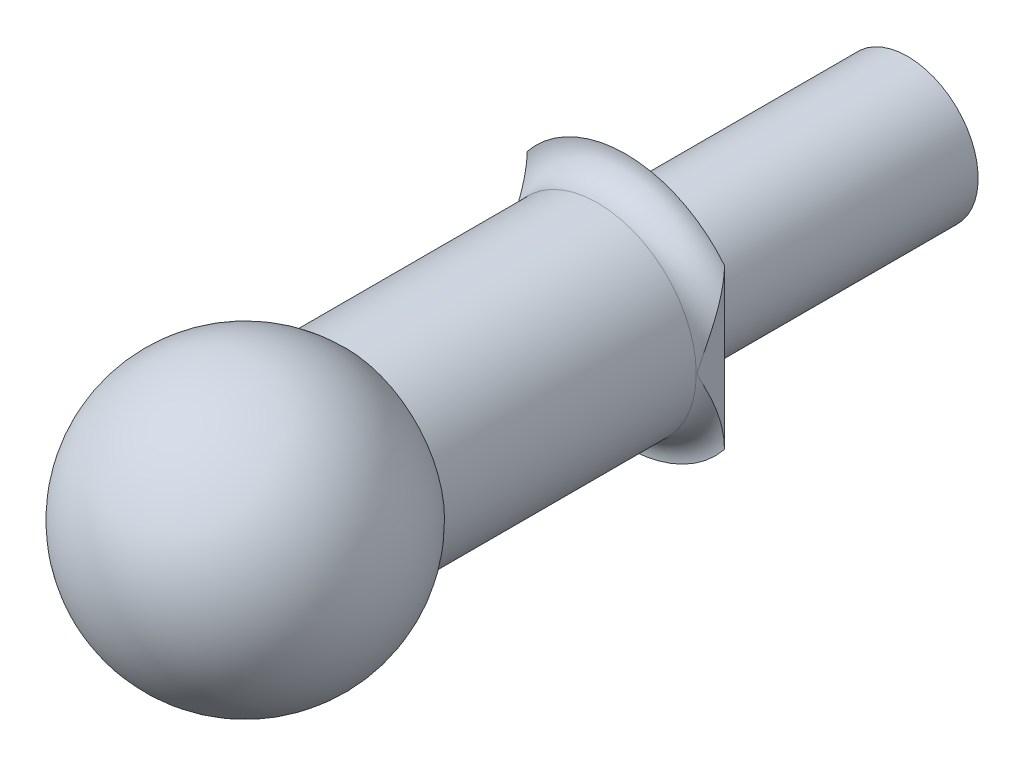
ISO-10303-21;
HEADER;
FILE_DESCRIPTION(('STEP AP214'),'2;1');
FILE_NAME('part.step','',(''),(''),'','','');
FILE_SCHEMA(('AUTOMOTIVE_DESIGN { 1 0 10303 214 1 1 1 1 }'));
ENDSEC;
DATA;
#1=APPLICATION_CONTEXT('core data for automotive mechanical design processes');
#2=APPLICATION_PROTOCOL_DEFINITION('international standard','automotive_design',2000,#1);
#3=PRODUCT_CONTEXT('',#1,'mechanical');
#4=PRODUCT('Part','Part','',(#3));
#5=PRODUCT_RELATED_PRODUCT_CATEGORY('part','',(#4));
#6=PRODUCT_DEFINITION_FORMATION('','',#4);
#7=PRODUCT_DEFINITION_CONTEXT('part definition',#1,'design');
#8=PRODUCT_DEFINITION('design','',#6,#7);
#9=PRODUCT_DEFINITION_SHAPE('','',#8);
#10=(LENGTH_UNIT() NAMED_UNIT(*) SI_UNIT(.MILLI.,.METRE.));
#11=(NAMED_UNIT(*) PLANE_ANGLE_UNIT() SI_UNIT($,.RADIAN.));
#12=(NAMED_UNIT(*) SI_UNIT($,.STERADIAN.) SOLID_ANGLE_UNIT());
#13=UNCERTAINTY_MEASURE_WITH_UNIT(LENGTH_MEASURE(1.E-05),#10,'distance_accuracy_value','');
#14=(GEOMETRIC_REPRESENTATION_CONTEXT(3) GLOBAL_UNCERTAINTY_ASSIGNED_CONTEXT((#13)) GLOBAL_UNIT_ASSIGNED_CONTEXT((#10,
#11,#12)) REPRESENTATION_CONTEXT('',''));
#15=CARTESIAN_POINT('',(0.,0.,0.));
#16=DIRECTION('',(0.,0.,1.));
#17=DIRECTION('',(1.,0.,0.));
#18=AXIS2_PLACEMENT_3D('',#15,#16,#17);
#19=CARTESIAN_POINT('',(91.6988035290815,-24.5,20.));
#20=DIRECTION('',(0.,0.,1.));
#21=DIRECTION('',(1.,0.,0.));
#22=AXIS2_PLACEMENT_3D('',#19,#20,#21);
#23=PLANE('',#22);
#24=CARTESIAN_POINT('',(80.,0.,20.));
#25=DIRECTION('',(0.,0.,-1.));
#26=DIRECTION('',(-1.,0.,0.));
#27=AXIS2_PLACEMENT_3D('',#24,#25,#26);
#28=CIRCLE('',#27,2.50000000000001);
#29=CARTESIAN_POINT('',(78.1001644808037,1.625,20.));
#30=VERTEX_POINT('',#29);
#31=CARTESIAN_POINT('',(78.1001644808037,-1.625,20.));
#32=VERTEX_POINT('',#31);
#33=EDGE_CURVE('E212',#30,#32,#28,.T.);
#34=ORIENTED_EDGE('',*,*,#33,.F.);
#35=DIRECTION('',(0.,1.,0.));
#36=VECTOR('',#35,1.);
#37=CARTESIAN_POINT('',(78.1001644808037,1.625,20.));
#38=LINE('',#37,#36);
#39=EDGE_CURVE('E214',#32,#30,#38,.T.);
#40=ORIENTED_EDGE('',*,*,#39,.F.);
#41=EDGE_LOOP('',(#34,#40));
#42=FACE_BOUND('',#41,.T.);
#43=DIRECTION('',(0.,-1.,0.));
#44=VECTOR('',#43,1.);
#45=CARTESIAN_POINT('',(83.5007284956135,0.,20.));
#46=LINE('',#45,#44);
#47=CARTESIAN_POINT('',(83.5007284956135,2.82752541986805,20.));
#48=VERTEX_POINT('',#47);
#49=CARTESIAN_POINT('',(83.5007284956135,-2.82752541986805,20.));
#50=VERTEX_POINT('',#49);
#51=EDGE_CURVE('E76',#48,#50,#46,.T.);
#52=ORIENTED_EDGE('',*,*,#51,.T.);
#53=CARTESIAN_POINT('',(80.,0.,20.));
#54=DIRECTION('',(0.,0.,-1.));
#55=DIRECTION('',(0.,1.,0.));
#56=AXIS2_PLACEMENT_3D('',#53,#54,#55);
#57=CIRCLE('',#56,4.5);
#58=CARTESIAN_POINT('',(76.4992715043866,-2.82752541986805,20.));
#59=VERTEX_POINT('',#58);
#60=EDGE_CURVE('E102',#50,#59,#57,.T.);
#61=ORIENTED_EDGE('',*,*,#60,.T.);
#62=DIRECTION('',(0.,-1.,0.));
#63=VECTOR('',#62,1.);
#64=CARTESIAN_POINT('',(76.4992715043866,0.,20.));
#65=LINE('',#64,#63);
#66=CARTESIAN_POINT('',(76.4992715043866,2.82752541986805,20.));
#67=VERTEX_POINT('',#66);
#68=EDGE_CURVE('E69',#67,#59,#65,.T.);
#69=ORIENTED_EDGE('',*,*,#68,.F.);
#70=EDGE_CURVE('E101',#67,#48,#57,.T.);
#71=ORIENTED_EDGE('',*,*,#70,.T.);
#72=EDGE_LOOP('',(#52,#61,#69,#71));
#73=FACE_BOUND('',#72,.T.);
#74=ADVANCED_FACE('F49',(#42,#73),#23,.F.);
#75=CARTESIAN_POINT('',(80.,0.,21.));
#76=DIRECTION('',(0.,0.,-1.));
#77=DIRECTION('',(0.,1.,0.));
#78=AXIS2_PLACEMENT_3D('',#75,#76,#77);
#79=TOROIDAL_SURFACE('',#78,4.5,1.);
#80=CARTESIAN_POINT('',(80.,0.,21.));
#81=DIRECTION('',(0.,0.,-1.));
#82=DIRECTION('',(0.,1.,0.));
#83=AXIS2_PLACEMENT_3D('',#80,#81,#82);
#84=CIRCLE('',#83,3.5);
#85=CARTESIAN_POINT('',(80.,3.49999999999999,21.));
#86=VERTEX_POINT('',#85);
#87=EDGE_CURVE('E110',#86,#86,#84,.T.);
#88=ORIENTED_EDGE('',*,*,#87,.T.);
#89=EDGE_LOOP('',(#88));
#90=FACE_BOUND('',#89,.T.);
#91=ORIENTED_EDGE('',*,*,#60,.F.);
#92=CARTESIAN_POINT('',(83.5007284956135,0.,20.9618363979552));
#93=CARTESIAN_POINT('',(83.5007284956135,0.00757466413143832,20.9618337924515));
#94=CARTESIAN_POINT('',(83.5007284956135,0.0151524918470172,20.9611702669489));
#95=CARTESIAN_POINT('',(83.5007284956135,0.0301410912420999,20.9587584599739));
#96=CARTESIAN_POINT('',(83.5007284956135,0.0375511585872441,20.9570062589756));
#97=CARTESIAN_POINT('',(83.5007284956135,0.0598823413708445,20.9506798754329));
#98=CARTESIAN_POINT('',(83.5007284956135,0.0744888281179546,20.9450777984116));
#99=CARTESIAN_POINT('',(83.5007284956135,0.116560752386152,20.9275792933788));
#100=CARTESIAN_POINT('',(83.5007284956135,0.14353246081445,20.9146225142181));
#101=CARTESIAN_POINT('',(83.5007284956135,0.197247647198134,20.8881801458461));
#102=CARTESIAN_POINT('',(83.5007284956135,0.223990835945403,20.8746939810419));
#103=CARTESIAN_POINT('',(83.5007284956135,0.276964187418344,20.8477296635443));
#104=CARTESIAN_POINT('',(83.5007284956135,0.30319591323833,20.834254579402));
#105=CARTESIAN_POINT('',(83.5007284956135,0.355631985890928,20.8072826989106));
#106=CARTESIAN_POINT('',(83.5007284956135,0.381836339818784,20.7937859160433));
#107=CARTESIAN_POINT('',(83.5007284956135,0.513412730519663,20.7261574822235));
#108=CARTESIAN_POINT('',(83.5007284956135,0.61896176584393,20.6723607670523));
#109=CARTESIAN_POINT('',(83.5007284956135,0.831426023685366,20.5674455039684));
#110=CARTESIAN_POINT('',(83.5007284956135,0.938341557438655,20.5163275802075));
#111=CARTESIAN_POINT('',(83.5007284956135,1.15477287189651,20.4178861366855));
#112=CARTESIAN_POINT('',(83.5007284956135,1.26430099711904,20.3705892937493));
#113=CARTESIAN_POINT('',(83.5007284956135,1.48566050112027,20.2818391549567));
#114=CARTESIAN_POINT('',(83.5007284956135,1.59749126385709,20.2403843188395));
#115=CARTESIAN_POINT('',(83.5007284956135,1.87975752064371,20.1465386893763));
#116=CARTESIAN_POINT('',(83.5007284956135,2.05187237306912,20.0988508041031));
#117=CARTESIAN_POINT('',(83.5007284956135,2.31352891035735,20.0461906765516));
#118=CARTESIAN_POINT('',(83.5007284956135,2.40117805263926,20.0317910434355));
#119=CARTESIAN_POINT('',(83.5007284956135,2.57735924382418,20.0104642470944));
#120=CARTESIAN_POINT('',(83.5007284956135,2.66589065456239,20.0035320296361));
#121=CARTESIAN_POINT('',(83.5007284956135,2.85488984530003,19.9982095850023));
#122=CARTESIAN_POINT('',(83.5007284956135,2.95540157006133,20.0010577197371));
#123=CARTESIAN_POINT('',(83.5007284956135,3.15521980586993,20.0205228883012));
#124=CARTESIAN_POINT('',(83.5007284956135,3.2545266138802,20.0371364565758));
#125=CARTESIAN_POINT('',(83.5007284956135,3.428467807967,20.0815823383157));
#126=CARTESIAN_POINT('',(83.5007284956135,3.50388451406726,20.1063053888355));
#127=CARTESIAN_POINT('',(83.5007284956135,3.64989939509249,20.1673660326826));
#128=CARTESIAN_POINT('',(83.5007284956135,3.72050515181636,20.2036848127953));
#129=CARTESIAN_POINT('',(83.5007284956135,3.8365295039209,20.2779782977506));
#130=CARTESIAN_POINT('',(83.5007284956135,3.8837548221039,20.3131232398856));
#131=CARTESIAN_POINT('',(83.5007284956135,3.97199432557057,20.3905282704298));
#132=CARTESIAN_POINT('',(83.5007284956135,4.01301568241065,20.4327800223692));
#133=CARTESIAN_POINT('',(83.5007284956135,4.08060537052516,20.5164182559021));
#134=CARTESIAN_POINT('',(83.5007284956135,4.10844304917005,20.5567754265885));
#135=CARTESIAN_POINT('',(83.5007284956135,4.15705564356204,20.6415687076925));
#136=CARTESIAN_POINT('',(83.5007284956135,4.17783339121593,20.6860031735043));
#137=CARTESIAN_POINT('',(83.5007284956135,4.21122906633683,20.7781586749284));
#138=CARTESIAN_POINT('',(83.5007284956135,4.22379984521273,20.8258969879116));
#139=CARTESIAN_POINT('',(83.5007284956135,4.2397321372433,20.9228887349768));
#140=CARTESIAN_POINT('',(83.5007284956135,4.24309783123231,20.9721414709444));
#141=CARTESIAN_POINT('',(83.5007284956135,4.24053088083215,21.0654494785605));
#142=CARTESIAN_POINT('',(83.5007284956135,4.23549423522726,21.1095320653474));
#143=CARTESIAN_POINT('',(83.5007284956135,4.21808370068542,21.1962109341693));
#144=CARTESIAN_POINT('',(83.5007284956135,4.2057102915856,21.2388073132119));
#145=CARTESIAN_POINT('',(83.5007284956135,4.17427420078582,21.3214845895068));
#146=CARTESIAN_POINT('',(83.5007284956135,4.15520411901903,21.3615626459229));
#147=CARTESIAN_POINT('',(83.5007284956135,4.11127210710026,21.4383861472664));
#148=CARTESIAN_POINT('',(83.5007284956135,4.08640868400517,21.4751307297611));
#149=CARTESIAN_POINT('',(83.5007284956135,4.02872991181225,21.5488037662728));
#150=CARTESIAN_POINT('',(83.5007284956135,3.99533042264996,21.5852729597609));
#151=CARTESIAN_POINT('',(83.5007284956135,3.92381099670696,21.6532208530043));
#152=CARTESIAN_POINT('',(83.5007284956135,3.88568768964724,21.6846959527099));
#153=CARTESIAN_POINT('',(83.5007284956135,3.78432136544029,21.7582642361317));
#154=CARTESIAN_POINT('',(83.5007284956135,3.71860038350911,21.7969569265838));
#155=CARTESIAN_POINT('',(83.5007284956135,3.58181378458114,21.8632900032363));
#156=CARTESIAN_POINT('',(83.5007284956135,3.51073721452603,21.8909069665798));
#157=CARTESIAN_POINT('',(83.5007284956135,3.33356739645129,21.9461725300379));
#158=CARTESIAN_POINT('',(83.5007284956135,3.22582316585526,21.9684919935829));
#159=CARTESIAN_POINT('',(83.5007284956135,3.00822790491408,21.9961067501933));
#160=CARTESIAN_POINT('',(83.5007284956135,2.89837318311355,22.0013688333369));
#161=CARTESIAN_POINT('',(83.5007284956135,2.69898592696382,21.9983437212476));
#162=CARTESIAN_POINT('',(83.5007284956135,2.60939727417319,21.9923503750965));
#163=CARTESIAN_POINT('',(83.5007284956135,2.43105745090582,21.9725755506094));
#164=CARTESIAN_POINT('',(83.5007284956135,2.3423069048241,21.958788669928));
#165=CARTESIAN_POINT('',(83.5007284956135,2.07769898282356,21.9076473086887));
#166=CARTESIAN_POINT('',(83.5007284956135,1.90373535181643,21.8605232648752));
#167=CARTESIAN_POINT('',(83.5007284956135,1.58052327619539,21.7546795531397));
#168=CARTESIAN_POINT('',(83.5007284956135,1.43064194244756,21.6977740466846));
#169=CARTESIAN_POINT('',(83.5007284956135,1.20939542170098,21.6054196526905));
#170=CARTESIAN_POINT('',(83.5007284956135,1.13649014012923,21.573591635764));
#171=CARTESIAN_POINT('',(83.5007284956135,0.991562801770125,21.5080414665707));
#172=CARTESIAN_POINT('',(83.5007284956135,0.919540489502248,21.4743198787441));
#173=CARTESIAN_POINT('',(83.5007284956135,0.810798658012255,21.4220604855507));
#174=CARTESIAN_POINT('',(83.5007284956135,0.773822387127545,21.4040519745893));
#175=CARTESIAN_POINT('',(83.5007284956135,0.699995762774756,21.3676941276045));
#176=CARTESIAN_POINT('',(83.5007284956135,0.66314555498624,21.3493444955869));
#177=CARTESIAN_POINT('',(83.5007284956135,0.588716050140764,21.3119554042457));
#178=CARTESIAN_POINT('',(83.5007284956135,0.551139819426647,21.2929098419207));
#179=CARTESIAN_POINT('',(83.5007284956135,0.476209297532915,21.2546979424141));
#180=CARTESIAN_POINT('',(83.5007284956135,0.438854684966919,21.2355322269426));
#181=CARTESIAN_POINT('',(83.5007284956135,0.368625004399304,21.1994108541558));
#182=CARTESIAN_POINT('',(83.5007284956135,0.335746017109992,21.182463695093));
#183=CARTESIAN_POINT('',(83.5007284956135,0.269540527310895,21.1484877032098));
#184=CARTESIAN_POINT('',(83.5007284956135,0.236213415047841,21.1314603552188));
#185=CARTESIAN_POINT('',(83.5007284956135,0.171717050300819,21.0990742060821));
#186=CARTESIAN_POINT('',(83.5007284956135,0.140567113951651,21.0836841107973));
#187=CARTESIAN_POINT('',(83.5007284956135,0.0934354618419294,21.0626556203382));
#188=CARTESIAN_POINT('',(83.5007284956135,0.0778563500551521,21.0560598403965));
#189=CARTESIAN_POINT('',(83.5007284956135,0.0459924777737022,21.0449480573795));
#190=CARTESIAN_POINT('',(83.5007284956135,0.0297208096869148,21.0404039655888));
#191=CARTESIAN_POINT('',(83.5007284956135,0.0108026664173249,21.0385783757771));
#192=CARTESIAN_POINT('',(83.5007284956135,0.0084919593266548,21.0384125925411));
#193=CARTESIAN_POINT('',(83.5007284956135,0.00386373018444433,21.0381995434668));
#194=CARTESIAN_POINT('',(83.5007284956135,0.00154620390037603,21.0381523831314));
#195=CARTESIAN_POINT('',(83.5007284956135,-0.00540556629925939,21.0381927097849));
#196=CARTESIAN_POINT('',(83.5007284956135,-0.0100401498227881,21.0384618909819));
#197=CARTESIAN_POINT('',(83.5007284956135,-0.0238806438574789,21.0399512916825));
#198=CARTESIAN_POINT('',(83.5007284956135,-0.0330086018703553,21.0418546526668));
#199=CARTESIAN_POINT('',(83.5007284956135,-0.0581242594984336,21.0486036743241));
#200=CARTESIAN_POINT('',(83.5007284956135,-0.0737653359398169,21.0545851215607));
#201=CARTESIAN_POINT('',(83.5007284956135,-0.104654232585914,21.0675050282092));
#202=CARTESIAN_POINT('',(83.5007284956135,-0.119900485969945,21.074446761744));
#203=CARTESIAN_POINT('',(83.5007284956135,-0.165975611912979,21.0961148487875));
#204=CARTESIAN_POINT('',(83.5007284956135,-0.196530750117783,21.1114334376377));
#205=CARTESIAN_POINT('',(83.5007284956135,-0.286763895773454,21.1571452812904));
#206=CARTESIAN_POINT('',(83.5007284956135,-0.346245943129324,21.1878953704649));
#207=CARTESIAN_POINT('',(83.5007284956135,-0.46538335159691,21.2491810667101));
#208=CARTESIAN_POINT('',(83.5007284956135,-0.52503880587397,21.2797165057139));
#209=CARTESIAN_POINT('',(83.5007284956135,-0.644183874974985,21.3399372702775));
#210=CARTESIAN_POINT('',(83.5007284956135,-0.703671056919427,21.3696274154046));
#211=CARTESIAN_POINT('',(83.5007284956135,-0.823074032739205,21.4281140360915));
#212=CARTESIAN_POINT('',(83.5007284956135,-0.882989772705625,21.4569106217028));
#213=CARTESIAN_POINT('',(83.5007284956135,-1.0655019659937,21.5424925745667));
#214=CARTESIAN_POINT('',(83.5007284956135,-1.18895520070413,21.5974840209933));
#215=CARTESIAN_POINT('',(83.5007284956135,-1.43887798579143,21.70044496136));
#216=CARTESIAN_POINT('',(83.5007284956135,-1.56534898604071,21.7484109976279));
#217=CARTESIAN_POINT('',(83.5007284956135,-1.82160931138835,21.8345823256343));
#218=CARTESIAN_POINT('',(83.5007284956135,-1.9513979707272,21.8727895590312));
#219=CARTESIAN_POINT('',(83.5007284956135,-2.21410030091055,21.9361325120424));
#220=CARTESIAN_POINT('',(83.5007284956135,-2.34700949326068,21.9612858950724));
#221=CARTESIAN_POINT('',(83.5007284956135,-2.55323669825716,21.9867958874448));
#222=CARTESIAN_POINT('',(83.5007284956135,-2.62579410411316,21.9932378326635));
#223=CARTESIAN_POINT('',(83.5007284956135,-2.77118118063982,22.0003616160374));
#224=CARTESIAN_POINT('',(83.5007284956135,-2.84401093460815,22.0010415178597));
#225=CARTESIAN_POINT('',(83.5007284956135,-3.06163908038673,21.9931305582746));
#226=CARTESIAN_POINT('',(83.5007284956135,-3.20646623870726,21.9747188735629));
#227=CARTESIAN_POINT('',(83.5007284956135,-3.41535932682735,21.9219636136556));
#228=CARTESIAN_POINT('',(83.5007284956135,-3.48277797272352,21.9006198706616));
#229=CARTESIAN_POINT('',(83.5007284956135,-3.61415741282298,21.848797869594));
#230=CARTESIAN_POINT('',(83.5007284956135,-3.6781163034047,21.8183146419556));
#231=CARTESIAN_POINT('',(83.5007284956135,-3.80105874028157,21.7469858924967));
#232=CARTESIAN_POINT('',(83.5007284956135,-3.85997670023232,21.7060253686254));
#233=CARTESIAN_POINT('',(83.5007284956135,-3.96885799165336,21.6135469402879));
#234=CARTESIAN_POINT('',(83.5007284956135,-4.01884448729446,21.5620571112571));
#235=CARTESIAN_POINT('',(83.5007284956135,-4.09193116650451,21.4676115169739));
#236=CARTESIAN_POINT('',(83.5007284956135,-4.11848968791566,21.427320304674));
#237=CARTESIAN_POINT('',(83.5007284956135,-4.16461108565765,21.3428938584835));
#238=CARTESIAN_POINT('',(83.5007284956135,-4.18417826872923,21.2987610119937));
#239=CARTESIAN_POINT('',(83.5007284956135,-4.21529075770168,21.207461072194));
#240=CARTESIAN_POINT('',(83.5007284956135,-4.22679252480831,21.1602789896576));
#241=CARTESIAN_POINT('',(83.5007284956135,-4.24083701641189,21.0645952005939));
#242=CARTESIAN_POINT('',(83.5007284956135,-4.24338281808933,21.0160939530918));
#243=CARTESIAN_POINT('',(83.5007284956135,-4.23952878889426,20.9237495096996));
#244=CARTESIAN_POINT('',(83.5007284956135,-4.23389676195421,20.8798721372561));
#245=CARTESIAN_POINT('',(83.5007284956135,-4.21537943821794,20.7936884851963));
#246=CARTESIAN_POINT('',(83.5007284956135,-4.20249438481546,20.7513821529103));
#247=CARTESIAN_POINT('',(83.5007284956135,-4.1700473769554,20.6691163496485));
#248=CARTESIAN_POINT('',(83.5007284956135,-4.15044223178516,20.6291740700354));
#249=CARTESIAN_POINT('',(83.5007284956135,-4.10548664119882,20.5526865901869));
#250=CARTESIAN_POINT('',(83.5007284956135,-4.08013458552891,20.5161423461179));
#251=CARTESIAN_POINT('',(83.5007284956135,-4.02137395166254,20.4428081736392));
#252=CARTESIAN_POINT('',(83.5007284956135,-3.98736738899191,20.4064993801362));
#253=CARTESIAN_POINT('',(83.5007284956135,-3.91467513862452,20.3389417741456));
#254=CARTESIAN_POINT('',(83.5007284956135,-3.87598626240982,20.3076964439812));
#255=CARTESIAN_POINT('',(83.5007284956135,-3.77295955984193,20.2345741180217));
#256=CARTESIAN_POINT('',(83.5007284956135,-3.70613585824713,20.1961852654224));
#257=CARTESIAN_POINT('',(83.5007284956135,-3.56720257112758,20.130619175462));
#258=CARTESIAN_POINT('',(83.5007284956135,-3.49508148476932,20.1034672350325));
#259=CARTESIAN_POINT('',(83.5007284956135,-3.31512591573893,20.0493790012239));
#260=CARTESIAN_POINT('',(83.5007284956135,-3.20566279616245,20.0279000473479));
#261=CARTESIAN_POINT('',(83.5007284956135,-2.9848080255784,20.0022056898246));
#262=CARTESIAN_POINT('',(83.5007284956135,-2.87341334594418,19.998020439005));
#263=CARTESIAN_POINT('',(83.5007284956135,-2.67078832133429,20.0031409722511));
#264=CARTESIAN_POINT('',(83.5007284956135,-2.57948005874035,20.0101891618936));
#265=CARTESIAN_POINT('',(83.5007284956135,-2.3977990191879,20.032218564401));
#266=CARTESIAN_POINT('',(83.5007284956135,-2.30742694718113,20.0472053669303));
#267=CARTESIAN_POINT('',(83.5007284956135,-2.0381864268058,20.1020667182499));
#268=CARTESIAN_POINT('',(83.5007284956135,-1.86133926896185,20.1518341589039));
#269=CARTESIAN_POINT('',(83.5007284956135,-1.54187619359275,20.2596767258944));
#270=CARTESIAN_POINT('',(83.5007284956135,-1.39831855905427,20.3151399300876));
#271=CARTESIAN_POINT('',(83.5007284956135,-1.11502149018773,20.4346695874711));
#272=CARTESIAN_POINT('',(83.5007284956135,-0.975278575927305,20.4987278612238));
#273=CARTESIAN_POINT('',(83.5007284956135,-0.78381269991892,20.590981551185));
#274=CARTESIAN_POINT('',(83.5007284956135,-0.730969405396426,20.6169234990123));
#275=CARTESIAN_POINT('',(83.5007284956135,-0.625577367094049,20.6694117489619));
#276=CARTESIAN_POINT('',(83.5007284956135,-0.573028637480599,20.6959580798452));
#277=CARTESIAN_POINT('',(83.5007284956135,-0.468141658206779,20.7493884388659));
#278=CARTESIAN_POINT('',(83.5007284956135,-0.4158033201254,20.7762722999304));
#279=CARTESIAN_POINT('',(83.5007284956135,-0.311201658775972,20.8301882873632));
#280=CARTESIAN_POINT('',(83.5007284956135,-0.258938318223962,20.8572203687249));
#281=CARTESIAN_POINT('',(83.5007284956135,-0.182220697361902,20.8956133308695));
#282=CARTESIAN_POINT('',(83.5007284956135,-0.158025475170233,20.9075371184759));
#283=CARTESIAN_POINT('',(83.5007284956135,-0.109120073580995,20.9307107032345));
#284=CARTESIAN_POINT('',(83.5007284956135,-0.0844083339751822,20.9419578748142));
#285=CARTESIAN_POINT('',(83.5007284956135,-0.0491486857213418,20.9538197376789));
#286=CARTESIAN_POINT('',(83.5007284956135,-0.0394453569215453,20.956677256516));
#287=CARTESIAN_POINT('',(83.5007284956135,-0.0246968446574362,20.9596919928763));
#288=CARTESIAN_POINT('',(83.5007284956135,-0.019788468826312,20.9604835771083));
#289=CARTESIAN_POINT('',(83.5007284956135,-0.0099204667575371,20.9615563159869));
#290=CARTESIAN_POINT('',(83.5007284956135,-0.00496091187221621,20.9618381043904));
#291=CARTESIAN_POINT('',(83.5007284956135,0.,20.9618363979552));
#292=B_SPLINE_CURVE_WITH_KNOTS('',3,(#92,#93,#94,#95,#96,#97,#98,#99,#100,#101,#102,#103,#104,
#105,#106,#107,#108,#109,#110,#111,#112,#113,#114,#115,#116,#117,#118,#119,#120,#121,#122,#123,
#124,#125,#126,#127,#128,#129,#130,#131,#132,#133,#134,#135,#136,#137,#138,#139,#140,#141,#142,
#143,#144,#145,#146,#147,#148,#149,#150,#151,#152,#153,#154,#155,#156,#157,#158,#159,#160,#161,
#162,#163,#164,#165,#166,#167,#168,#169,#170,#171,#172,#173,#174,#175,#176,#177,#178,#179,#180,
#181,#182,#183,#184,#185,#186,#187,#188,#189,#190,#191,#192,#193,#194,#195,#196,#197,#198,#199,
#200,#201,#202,#203,#204,#205,#206,#207,#208,#209,#210,#211,#212,#213,#214,#215,#216,#217,#218,
#219,#220,#221,#222,#223,#224,#225,#226,#227,#228,#229,#230,#231,#232,#233,#234,#235,#236,#237,
#238,#239,#240,#241,#242,#243,#244,#245,#246,#247,#248,#249,#250,#251,#252,#253,#254,#255,#256,
#257,#258,#259,#260,#261,#262,#263,#264,#265,#266,#267,#268,#269,#270,#271,#272,#273,#274,#275,
#276,#277,#278,#279,#280,#281,#282,#283,#284,#285,#286,#287,#288,#289,#290,#291),.UNSPECIFIED.,
.T.,.F.,(4,2,2,2,2,2,2,2,2,2,2,2,2,2,2,2,2,2,2,2,2,2,2,2,2,2,2,2,2,2,2,2,2,2,2,2,2,2,2,2,2,2,2,
2,2,2,2,2,2,2,2,2,2,2,2,2,2,2,2,2,2,2,2,2,2,2,2,2,2,2,2,2,2,2,2,2,2,2,2,2,2,2,2,2,2,2,2,2,2,2,2,
2,2,2,2,2,2,2,2,4),(0.,0.0227103545851429,0.045502950189152,0.0923170048923252,0.18206946978625,
0.271922381775578,0.360392980454146,0.448821227520487,0.804207970270812,1.1596771524286,
1.5174451981417,1.8751187401679,2.40934948975828,2.67557033604912,2.9416108804229,
3.24251294264155,3.54333927344238,3.78065074035347,4.01757912691591,4.19355433484489,
4.36932454082948,4.51580153617581,4.66221970654929,4.80947180739615,4.95665701706645,
5.08912674517567,5.22158781048901,5.3541957131137,5.48683782664191,5.63464461121838,
5.78255746462774,6.01006488604633,6.23805093283984,6.5663171376749,6.89522207878939,
7.16420463703995,7.43337387846237,7.9724548669192,8.45301394532745,8.69163786889714,
8.93019103659969,9.05357536488858,9.17707227588818,9.3034527170874,9.42940806793898,
9.54036994058321,9.65267169440363,9.75680706028517,9.80760667483051,9.85768799817054,
9.86463354734079,9.87158527168942,9.88548527552342,9.91332863234318,9.96341976522083,
10.0136860995516,10.1161960883011,10.3170958813424,10.5181385338075,10.7175878048832,
10.9170124133672,11.3223021064102,11.7277906040167,12.1331983607238,12.5380561126521,
12.7563635806206,12.9747444078425,13.4088366718924,13.620471689445,13.8322219921889,
14.0464045101294,14.2600232070581,14.4042200214195,14.5483278551992,14.6932077458972,
14.8380378524436,14.9701177460615,15.1021932076668,15.2351339626658,15.3681120131018,
15.5168018317953,15.6655934797133,15.8954877329976,16.1258967533854,16.4586922775106,
16.7920678105972,17.0664136393086,17.3409528952046,17.8904640450643,18.3518574996062,
18.8128149459549,18.9894196045842,19.1660326849731,19.3425615446754,19.5190394819991,
19.5999982161303,19.6812531572483,19.711511067115,19.7264033971327,19.7412772008721),.UNSPECIFIED.);
#293=EDGE_CURVE('E12',#50,#48,#292,.T.);
#294=ORIENTED_EDGE('',*,*,#293,.T.);
#295=ORIENTED_EDGE('',*,*,#70,.F.);
#296=CARTESIAN_POINT('',(76.4992715043866,0.,20.9618363979551));
#297=CARTESIAN_POINT('',(76.4992715043866,0.00757466413144544,20.9618337924515));
#298=CARTESIAN_POINT('',(76.4992715043866,0.0151524918470305,20.9611702669488));
#299=CARTESIAN_POINT('',(76.4992715043866,0.0301410912421273,20.9587584599739));
#300=CARTESIAN_POINT('',(76.4992715043866,0.0375511585872794,20.9570062589756));
#301=CARTESIAN_POINT('',(76.4992715043866,0.0598823413708993,20.9506798754329));
#302=CARTESIAN_POINT('',(76.4992715043866,0.0744888281180177,20.9450777984116));
#303=CARTESIAN_POINT('',(76.4992715043866,0.116560752386246,20.9275792933787));
#304=CARTESIAN_POINT('',(76.4992715043866,0.143532460814569,20.914622514218));
#305=CARTESIAN_POINT('',(76.4992715043866,0.1972476471983,20.888180145846));
#306=CARTESIAN_POINT('',(76.4992715043866,0.22399083594559,20.8746939810418));
#307=CARTESIAN_POINT('',(76.4992715043866,0.276964187418575,20.8477296635442));
#308=CARTESIAN_POINT('',(76.4992715043866,0.303195913238583,20.8342545794018));
#309=CARTESIAN_POINT('',(76.4992715043866,0.355631985891226,20.8072826989104));
#310=CARTESIAN_POINT('',(76.4992715043866,0.381836339819105,20.7937859160431));
#311=CARTESIAN_POINT('',(76.4992715043866,0.513412730520098,20.7261574822233));
#312=CARTESIAN_POINT('',(76.4992715043866,0.618961765844455,20.6723607670521));
#313=CARTESIAN_POINT('',(76.4992715043866,0.831426023686076,20.567445503968));
#314=CARTESIAN_POINT('',(76.4992715043866,0.938341557439459,20.5163275802071));
#315=CARTESIAN_POINT('',(76.4992715043866,1.1547728718975,20.4178861366851));
#316=CARTESIAN_POINT('',(76.4992715043866,1.26430099712012,20.3705892937489));
#317=CARTESIAN_POINT('',(76.4992715043866,1.48566050112154,20.2818391549562));
#318=CARTESIAN_POINT('',(76.4992715043866,1.59749126385847,20.240384318839));
#319=CARTESIAN_POINT('',(76.4992715043866,1.87975752064495,20.146538689376));
#320=CARTESIAN_POINT('',(76.4992715043866,2.05187237307012,20.0988508041029));
#321=CARTESIAN_POINT('',(76.4992715043866,2.31352891035796,20.0461906765514));
#322=CARTESIAN_POINT('',(76.4992715043866,2.40117805263974,20.0317910434354));
#323=CARTESIAN_POINT('',(76.4992715043866,2.57735924382441,20.0104642470944));
#324=CARTESIAN_POINT('',(76.4992715043866,2.66589065456249,20.0035320296361));
#325=CARTESIAN_POINT('',(76.4992715043866,2.85488984530008,19.9982095850024));
#326=CARTESIAN_POINT('',(76.4992715043866,2.95540157006145,20.0010577197371));
#327=CARTESIAN_POINT('',(76.4992715043866,3.15521980587019,20.0205228883012));
#328=CARTESIAN_POINT('',(76.4992715043866,3.25452661388053,20.0371364565759));
#329=CARTESIAN_POINT('',(76.4992715043866,3.42846780796736,20.0815823383158));
#330=CARTESIAN_POINT('',(76.4992715043866,3.50388451406758,20.1063053888357));
#331=CARTESIAN_POINT('',(76.4992715043866,3.64989939509272,20.1673660326827));
#332=CARTESIAN_POINT('',(76.4992715043866,3.72050515181655,20.2036848127954));
#333=CARTESIAN_POINT('',(76.4992715043866,3.83652950392104,20.2779782977507));
#334=CARTESIAN_POINT('',(76.4992715043866,3.88375482210404,20.3131232398857));
#335=CARTESIAN_POINT('',(76.4992715043866,3.97199432557069,20.3905282704299));
#336=CARTESIAN_POINT('',(76.4992715043866,4.01301568241076,20.4327800223693));
#337=CARTESIAN_POINT('',(76.4992715043866,4.08060537052526,20.5164182559022));
#338=CARTESIAN_POINT('',(76.4992715043866,4.10844304917014,20.5567754265886));
#339=CARTESIAN_POINT('',(76.4992715043866,4.1570556435621,20.6415687076927));
#340=CARTESIAN_POINT('',(76.4992715043866,4.17783339121598,20.6860031735045));
#341=CARTESIAN_POINT('',(76.4992715043866,4.21122906633687,20.7781586749285));
#342=CARTESIAN_POINT('',(76.4992715043866,4.22379984521277,20.8258969879117));
#343=CARTESIAN_POINT('',(76.4992715043866,4.23973213724332,20.9228887349769));
#344=CARTESIAN_POINT('',(76.4992715043866,4.24309783123232,20.9721414709445));
#345=CARTESIAN_POINT('',(76.4992715043866,4.24053088083214,21.0654494785606));
#346=CARTESIAN_POINT('',(76.4992715043866,4.23549423522724,21.1095320653475));
#347=CARTESIAN_POINT('',(76.4992715043866,4.21808370068539,21.1962109341694));
#348=CARTESIAN_POINT('',(76.4992715043866,4.20571029158556,21.238807313212));
#349=CARTESIAN_POINT('',(76.4992715043866,4.17427420078577,21.3214845895069));
#350=CARTESIAN_POINT('',(76.4992715043866,4.15520411901897,21.3615626459231));
#351=CARTESIAN_POINT('',(76.4992715043866,4.11127210710019,21.4383861472665));
#352=CARTESIAN_POINT('',(76.4992715043866,4.08640868400509,21.4751307297612));
#353=CARTESIAN_POINT('',(76.4992715043866,4.02872991181217,21.5488037662729));
#354=CARTESIAN_POINT('',(76.4992715043866,3.99533042264987,21.585272959761));
#355=CARTESIAN_POINT('',(76.4992715043866,3.92381099670686,21.6532208530044));
#356=CARTESIAN_POINT('',(76.4992715043866,3.88568768964713,21.68469595271));
#357=CARTESIAN_POINT('',(76.4992715043866,3.78432136544016,21.7582642361317));
#358=CARTESIAN_POINT('',(76.4992715043866,3.71860038350897,21.7969569265839));
#359=CARTESIAN_POINT('',(76.4992715043866,3.58181378458097,21.8632900032364));
#360=CARTESIAN_POINT('',(76.4992715043866,3.51073721452586,21.8909069665799));
#361=CARTESIAN_POINT('',(76.4992715043866,3.33356739645108,21.946172530038));
#362=CARTESIAN_POINT('',(76.4992715043866,3.22582316585504,21.968491993583));
#363=CARTESIAN_POINT('',(76.4992715043866,3.00822790491382,21.9961067501933));
#364=CARTESIAN_POINT('',(76.4992715043866,2.89837318311327,22.0013688333369));
#365=CARTESIAN_POINT('',(76.4992715043866,2.69898592696351,21.9983437212476));
#366=CARTESIAN_POINT('',(76.4992715043866,2.60939727417286,21.9923503750965));
#367=CARTESIAN_POINT('',(76.4992715043866,2.43105745090545,21.9725755506094));
#368=CARTESIAN_POINT('',(76.4992715043866,2.34230690482371,21.958788669928));
#369=CARTESIAN_POINT('',(76.4992715043866,2.07769898282312,21.9076473086886));
#370=CARTESIAN_POINT('',(76.4992715043866,1.90373535181596,21.8605232648751));
#371=CARTESIAN_POINT('',(76.4992715043866,1.58052327619493,21.7546795531396));
#372=CARTESIAN_POINT('',(76.4992715043866,1.43064194244714,21.6977740466844));
#373=CARTESIAN_POINT('',(76.4992715043866,1.20939542170062,21.6054196526904));
#374=CARTESIAN_POINT('',(76.4992715043866,1.13649014012889,21.5735916357639));
#375=CARTESIAN_POINT('',(76.4992715043866,0.991562801769826,21.5080414665706));
#376=CARTESIAN_POINT('',(76.4992715043866,0.919540489501971,21.474319878744));
#377=CARTESIAN_POINT('',(76.4992715043866,0.810798658012018,21.4220604855506));
#378=CARTESIAN_POINT('',(76.4992715043866,0.773822387127325,21.4040519745892));
#379=CARTESIAN_POINT('',(76.4992715043866,0.699995762774567,21.3676941276044));
#380=CARTESIAN_POINT('',(76.4992715043866,0.663145554986065,21.3493444955868));
#381=CARTESIAN_POINT('',(76.4992715043866,0.58871605014061,21.3119554042456));
#382=CARTESIAN_POINT('',(76.4992715043866,0.551139819426499,21.2929098419207));
#383=CARTESIAN_POINT('',(76.4992715043866,0.47620929753278,21.254697942414));
#384=CARTESIAN_POINT('',(76.4992715043866,0.438854684966791,21.2355322269426));
#385=CARTESIAN_POINT('',(76.4992715043866,0.368625004399167,21.1994108541557));
#386=CARTESIAN_POINT('',(76.4992715043866,0.335746017109839,21.182463695093));
#387=CARTESIAN_POINT('',(76.4992715043866,0.269540527310708,21.1484877032097));
#388=CARTESIAN_POINT('',(76.4992715043866,0.236213415047636,21.1314603552187));
#389=CARTESIAN_POINT('',(76.4992715043866,0.171717050300598,21.0990742060821));
#390=CARTESIAN_POINT('',(76.4992715043866,0.140567113951432,21.0836841107972));
#391=CARTESIAN_POINT('',(76.4992715043866,0.0934354618417112,21.0626556203382));
#392=CARTESIAN_POINT('',(76.4992715043866,0.0778563500549353,21.0560598403965));
#393=CARTESIAN_POINT('',(76.4992715043866,0.0459924777734827,21.0449480573795));
#394=CARTESIAN_POINT('',(76.4992715043866,0.0297208096866912,21.0404039655888));
#395=CARTESIAN_POINT('',(76.4992715043866,0.0108026664170923,21.0385783757771));
#396=CARTESIAN_POINT('',(76.4992715043866,0.00849195932640897,21.0384125925411));
#397=CARTESIAN_POINT('',(76.4992715043866,0.00386373018417136,21.0381995434668));
#398=CARTESIAN_POINT('',(76.4992715043866,0.00154620390008916,21.0381523831315));
#399=CARTESIAN_POINT('',(76.4992715043866,-0.00540556629958738,21.038192709785));
#400=CARTESIAN_POINT('',(76.4992715043866,-0.0100401498231427,21.038461890982));
#401=CARTESIAN_POINT('',(76.4992715043866,-0.0238806438579113,21.0399512916827));
#402=CARTESIAN_POINT('',(76.4992715043866,-0.0330086018708362,21.041854652667));
#403=CARTESIAN_POINT('',(76.4992715043866,-0.0581242594991792,21.0486036743244));
#404=CARTESIAN_POINT('',(76.4992715043866,-0.0737653359407711,21.0545851215611));
#405=CARTESIAN_POINT('',(76.4992715043866,-0.104654232587279,21.0675050282098));
#406=CARTESIAN_POINT('',(76.4992715043866,-0.119900485971511,21.0744467617448));
#407=CARTESIAN_POINT('',(76.4992715043866,-0.165975611915153,21.0961148487886));
#408=CARTESIAN_POINT('',(76.4992715043866,-0.196530750120364,21.111433437639));
#409=CARTESIAN_POINT('',(76.4992715043866,-0.286763895777255,21.1571452812924));
#410=CARTESIAN_POINT('',(76.4992715043866,-0.346245943133947,21.1878953704673));
#411=CARTESIAN_POINT('',(76.4992715043866,-0.46538335160318,21.2491810667133));
#412=CARTESIAN_POINT('',(76.4992715043866,-0.525038805881065,21.2797165057176));
#413=CARTESIAN_POINT('',(76.4992715043866,-0.644183874983761,21.3399372702819));
#414=CARTESIAN_POINT('',(76.4992715043866,-0.703671056929061,21.3696274154093));
#415=CARTESIAN_POINT('',(76.4992715043866,-0.823074032750573,21.428114036097));
#416=CARTESIAN_POINT('',(76.4992715043866,-0.882989772717868,21.4569106217087));
#417=CARTESIAN_POINT('',(76.4992715043866,-1.06550196600874,21.5424925745736));
#418=CARTESIAN_POINT('',(76.4992715043866,-1.18895520072113,21.5974840210008));
#419=CARTESIAN_POINT('',(76.4992715043866,-1.43887798581249,21.7004449613682));
#420=CARTESIAN_POINT('',(76.4992715043866,-1.56534898606385,21.7484109976364));
#421=CARTESIAN_POINT('',(76.4992715043866,-1.82160931141571,21.8345823256428));
#422=CARTESIAN_POINT('',(76.4992715043866,-1.95139797075669,21.8727895590394));
#423=CARTESIAN_POINT('',(76.4992715043866,-2.21410030094433,21.9361325120494));
#424=CARTESIAN_POINT('',(76.4992715043866,-2.34700949329664,21.9612858950785));
#425=CARTESIAN_POINT('',(76.4992715043866,-2.55323669829398,21.9867958874485));
#426=CARTESIAN_POINT('',(76.4992715043866,-2.62579410414867,21.9932378326661));
#427=CARTESIAN_POINT('',(76.4992715043866,-2.77118118067263,22.0003616160381));
#428=CARTESIAN_POINT('',(76.4992715043866,-2.84401093463958,22.0010415178595));
#429=CARTESIAN_POINT('',(76.4992715043866,-3.06163908041392,21.9931305582718));
#430=CARTESIAN_POINT('',(76.4992715043866,-3.20646623873145,21.9747188735586));
#431=CARTESIAN_POINT('',(76.4992715043866,-3.41535932684764,21.9219636136496));
#432=CARTESIAN_POINT('',(76.4992715043866,-3.48277797274295,21.9006198706549));
#433=CARTESIAN_POINT('',(76.4992715043866,-3.6141574128406,21.848797869586));
#434=CARTESIAN_POINT('',(76.4992715043866,-3.67811630342136,21.818314641947));
#435=CARTESIAN_POINT('',(76.4992715043866,-3.80105874029618,21.7469858924871));
#436=CARTESIAN_POINT('',(76.4992715043866,-3.85997670024584,21.7060253686153));
#437=CARTESIAN_POINT('',(76.4992715043866,-3.96885799166458,21.613546940277));
#438=CARTESIAN_POINT('',(76.4992715043866,-4.01884448730449,21.5620571112459));
#439=CARTESIAN_POINT('',(76.4992715043866,-4.09193116651255,21.4676115169624));
#440=CARTESIAN_POINT('',(76.4992715043866,-4.11848968792292,21.4273203046622));
#441=CARTESIAN_POINT('',(76.4992715043866,-4.16461108566332,21.3428938584715));
#442=CARTESIAN_POINT('',(76.4992715043866,-4.1841782687341,21.2987610119817));
#443=CARTESIAN_POINT('',(76.4992715043866,-4.21529075770494,21.2074610721821));
#444=CARTESIAN_POINT('',(76.4992715043866,-4.22679252481077,21.1602789896458));
#445=CARTESIAN_POINT('',(76.4992715043866,-4.24083701641282,21.0645952005825));
#446=CARTESIAN_POINT('',(76.4992715043866,-4.24338281808954,21.0160939530807));
#447=CARTESIAN_POINT('',(76.4992715043866,-4.2395287888932,20.9237495096889));
#448=CARTESIAN_POINT('',(76.4992715043866,-4.23389676195257,20.8798721372457));
#449=CARTESIAN_POINT('',(76.4992715043866,-4.21537943821519,20.7936884851862));
#450=CARTESIAN_POINT('',(76.4992715043866,-4.2024943848122,20.7513821529006));
#451=CARTESIAN_POINT('',(76.4992715043866,-4.17004737695113,20.6691163496391));
#452=CARTESIAN_POINT('',(76.4992715043866,-4.15044223178035,20.6291740700262));
#453=CARTESIAN_POINT('',(76.4992715043866,-4.10548664119299,20.552686590178));
#454=CARTESIAN_POINT('',(76.4992715043866,-4.0801345855226,20.5161423461092));
#455=CARTESIAN_POINT('',(76.4992715043866,-4.02137395165514,20.4428081736309));
#456=CARTESIAN_POINT('',(76.4992715043866,-3.9873673889839,20.4064993801281));
#457=CARTESIAN_POINT('',(76.4992715043866,-3.91467513861534,20.3389417741378));
#458=CARTESIAN_POINT('',(76.4992715043866,-3.87598626240007,20.3076964439736));
#459=CARTESIAN_POINT('',(76.4992715043866,-3.77295955983051,20.2345741180146));
#460=CARTESIAN_POINT('',(76.4992715043866,-3.70613585823461,20.1961852654156));
#461=CARTESIAN_POINT('',(76.4992715043866,-3.5672025711129,20.1306191754559));
#462=CARTESIAN_POINT('',(76.4992715043866,-3.4950814847536,20.103467235027));
#463=CARTESIAN_POINT('',(76.4992715043866,-3.31512591572043,20.0493790012195));
#464=CARTESIAN_POINT('',(76.4992715043866,-3.20566279614224,20.0279000473444));
#465=CARTESIAN_POINT('',(76.4992715043866,-2.98480802555491,20.002205689823));
#466=CARTESIAN_POINT('',(76.4992715043866,-2.87341334591914,19.9980204390045));
#467=CARTESIAN_POINT('',(76.4992715043866,-2.670788321306,20.0031409722528));
#468=CARTESIAN_POINT('',(76.4992715043866,-2.57948005871035,20.0101891618963));
#469=CARTESIAN_POINT('',(76.4992715043866,-2.39779901915458,20.0322185644059));
#470=CARTESIAN_POINT('',(76.4992715043866,-2.30742694714619,20.0472053669365));
#471=CARTESIAN_POINT('',(76.4992715043866,-2.03818642676615,20.1020667182599));
#472=CARTESIAN_POINT('',(76.4992715043866,-1.86133926891923,20.1518341589165));
#473=CARTESIAN_POINT('',(76.4992715043866,-1.54187619355144,20.2596767259098));
#474=CARTESIAN_POINT('',(76.4992715043866,-1.398318559017,20.3151399301026));
#475=CARTESIAN_POINT('',(76.4992715043866,-1.11502149015829,20.4346695874843));
#476=CARTESIAN_POINT('',(76.4992715043866,-0.975278575901659,20.4987278612358));
#477=CARTESIAN_POINT('',(76.4992715043866,-0.783812699898638,20.5909815511949));
#478=CARTESIAN_POINT('',(76.4992715043866,-0.730969405377806,20.6169234990215));
#479=CARTESIAN_POINT('',(76.4992715043866,-0.625577367078728,20.6694117489696));
#480=CARTESIAN_POINT('',(76.4992715043866,-0.573028637466914,20.6959580798521));
#481=CARTESIAN_POINT('',(76.4992715043866,-0.468141658196332,20.7493884388712));
#482=CARTESIAN_POINT('',(76.4992715043866,-0.415803320116552,20.776272299935));
#483=CARTESIAN_POINT('',(76.4992715043866,-0.311201658770307,20.8301882873661));
#484=CARTESIAN_POINT('',(76.4992715043866,-0.258938318219879,20.857220368727));
#485=CARTESIAN_POINT('',(76.4992715043866,-0.182220697359678,20.8956133308706));
#486=CARTESIAN_POINT('',(76.4992715043866,-0.158025475168277,20.9075371184769));
#487=CARTESIAN_POINT('',(76.4992715043866,-0.109120073579577,20.9307107032351));
#488=CARTESIAN_POINT('',(76.4992715043866,-0.0844083339740338,20.9419578748146));
#489=CARTESIAN_POINT('',(76.4992715043866,-0.0491486857206122,20.9538197376791));
#490=CARTESIAN_POINT('',(76.4992715043866,-0.0394453569209574,20.9566772565161));
#491=CARTESIAN_POINT('',(76.4992715043866,-0.0246968446570648,20.9596919928764));
#492=CARTESIAN_POINT('',(76.4992715043866,-0.0197884688260117,20.9604835771083));
#493=CARTESIAN_POINT('',(76.4992715043866,-0.00992046675738398,20.9615563159868));
#494=CARTESIAN_POINT('',(76.4992715043866,-0.00496091187213916,20.9618381043903));
#495=CARTESIAN_POINT('',(76.4992715043866,0.,20.9618363979551));
#496=B_SPLINE_CURVE_WITH_KNOTS('',3,(#296,#297,#298,#299,#300,#301,#302,#303,#304,#305,#306,
#307,#308,#309,#310,#311,#312,#313,#314,#315,#316,#317,#318,#319,#320,#321,#322,#323,#324,#325,
#326,#327,#328,#329,#330,#331,#332,#333,#334,#335,#336,#337,#338,#339,#340,#341,#342,#343,#344,
#345,#346,#347,#348,#349,#350,#351,#352,#353,#354,#355,#356,#357,#358,#359,#360,#361,#362,#363,
#364,#365,#366,#367,#368,#369,#370,#371,#372,#373,#374,#375,#376,#377,#378,#379,#380,#381,#382,
#383,#384,#385,#386,#387,#388,#389,#390,#391,#392,#393,#394,#395,#396,#397,#398,#399,#400,#401,
#402,#403,#404,#405,#406,#407,#408,#409,#410,#411,#412,#413,#414,#415,#416,#417,#418,#419,#420,
#421,#422,#423,#424,#425,#426,#427,#428,#429,#430,#431,#432,#433,#434,#435,#436,#437,#438,#439,
#440,#441,#442,#443,#444,#445,#446,#447,#448,#449,#450,#451,#452,#453,#454,#455,#456,#457,#458,
#459,#460,#461,#462,#463,#464,#465,#466,#467,#468,#469,#470,#471,#472,#473,#474,#475,#476,#477,
#478,#479,#480,#481,#482,#483,#484,#485,#486,#487,#488,#489,#490,#491,#492,#493,#494,#495),
.UNSPECIFIED.,.T.,.F.,(4,2,2,2,2,2,2,2,2,2,2,2,2,2,2,2,2,2,2,2,2,2,2,2,2,2,2,2,2,2,2,2,2,2,2,2,
2,2,2,2,2,2,2,2,2,2,2,2,2,2,2,2,2,2,2,2,2,2,2,2,2,2,2,2,2,2,2,2,2,2,2,2,2,2,2,2,2,2,2,2,2,2,2,2,
2,2,2,2,2,2,2,2,2,2,2,2,2,2,2,4),(0.,0.0227103545851631,0.045502950189191,0.0923170048923976,
0.182069469786395,0.271922381775792,0.360392980454439,0.448821227520853,0.804207970271477,
1.15967715242957,1.51744519814295,1.87511874016943,2.40934948975901,2.67557033604946,
2.94161088042285,3.24251294264172,3.54333927344277,3.78065074035373,4.01757912691606,
4.19355433484504,4.36932454082962,4.51580153617594,4.66221970654942,4.80947180739626,
4.95665701706655,5.08912674517577,5.22158781048911,5.3541957131138,5.48683782664201,
5.63464461121849,5.78255746462786,6.01006488604647,6.23805093284001,6.56631713767512,
6.89522207878966,7.16420463704027,7.43337387846275,7.9724548669197,8.45301394532784,
8.69163786889746,8.93019103659994,9.05357536488878,9.17707227588832,9.30345271708753,
9.42940806793908,9.54036994058337,9.65267169440384,9.75680706028537,9.80760667483069,
9.85768799817071,9.86463354734099,9.87158527168967,9.88548527552375,9.91332863234368,
9.96341976522203,10.0136860995535,10.1161960883044,10.3170958813485,10.5181385338163,
10.7175878048949,10.9170124133816,11.3223021064307,11.7277906040433,12.1331983607563,
12.5380561126903,12.7563635806547,12.9747444078724,13.4088366719141,13.6204716894648,
13.8322219922068,14.0464045101456,14.2600232070724,14.4042200214329,14.5483278552118,
14.6932077459088,14.8380378524543,14.9701177460719,15.1021932076769,15.2351339626763,
15.3681120131125,15.5168018318069,15.6655934797259,15.8954877330126,16.1258967534028,
16.4586922775325,16.7920678106236,17.0664136393404,17.3409528952418,17.8904640451122,
18.3518574996424,18.8128149459792,18.9894196046031,19.1660326849866,19.3425615446835,
19.5190394820018,19.5999982161321,19.6812531572492,19.7115110671154,19.7264033971328,
19.741277200872),.UNSPECIFIED.);
#497=EDGE_CURVE('E63',#59,#67,#496,.T.);
#498=ORIENTED_EDGE('',*,*,#497,.F.);
#499=EDGE_LOOP('',(#91,#294,#295,#498));
#500=FACE_BOUND('',#499,.T.);
#501=ADVANCED_FACE('F51',(#90,#500),#79,.F.);
#502=CARTESIAN_POINT('',(80.,0.,-33.5));
#503=DIRECTION('',(0.,0.,-1.));
#504=DIRECTION('',(0.,1.,0.));
#505=AXIS2_PLACEMENT_3D('',#502,#503,#504);
#506=CYLINDRICAL_SURFACE('',#505,3.5);
#507=CARTESIAN_POINT('',(80.,0.,29.9292857857286));
#508=DIRECTION('',(0.,0.,1.));
#509=DIRECTION('',(0.,-1.,0.));
#510=AXIS2_PLACEMENT_3D('',#507,#508,#509);
#511=CIRCLE('',#510,3.5);
#512=CARTESIAN_POINT('',(80.,-3.5,29.9292857857286));
#513=VERTEX_POINT('',#512);
#514=EDGE_CURVE('E98',#513,#513,#511,.T.);
#515=ORIENTED_EDGE('',*,*,#514,.F.);
#516=EDGE_LOOP('',(#515));
#517=FACE_BOUND('',#516,.T.);
#518=ORIENTED_EDGE('',*,*,#87,.F.);
#519=EDGE_LOOP('',(#518));
#520=FACE_BOUND('',#519,.T.);
#521=ADVANCED_FACE('F147',(#517,#520),#506,.T.);
#522=CARTESIAN_POINT('',(80.,0.,33.5));
#523=DIRECTION('',(0.,1.,0.));
#524=DIRECTION('',(1.,0.,0.));
#525=AXIS2_PLACEMENT_3D('',#522,#523,#524);
#526=SPHERICAL_SURFACE('',#525,5.00000000000001);
#527=CARTESIAN_POINT('',(80.,0.,33.5));
#528=DIRECTION('',(0.,0.,1.));
#529=DIRECTION('',(0.,-1.,0.));
#530=AXIS2_PLACEMENT_3D('',#527,#528,#529);
#531=SPHERICAL_SURFACE('',#530,5.00000000000001);
#532=ORIENTED_EDGE('',*,*,#514,.T.);
#533=EDGE_LOOP('',(#532));
#534=FACE_BOUND('',#533,.T.);
#535=ADVANCED_FACE('F141',(#534),#531,.T.);
#536=CARTESIAN_POINT('',(80.,0.,10.));
#537=DIRECTION('',(0.,0.,1.));
#538=DIRECTION('',(1.,0.,0.));
#539=AXIS2_PLACEMENT_3D('',#536,#537,#538);
#540=CYLINDRICAL_SURFACE('',#539,2.50000000000001);
#541=ORIENTED_EDGE('',*,*,#33,.T.);
#542=DIRECTION('',(0.,0.,1.));
#543=VECTOR('',#542,1.);
#544=CARTESIAN_POINT('',(78.1001644808037,-1.625,10.));
#545=LINE('',#544,#543);
#546=CARTESIAN_POINT('',(78.1001644808037,-1.625,10.));
#547=VERTEX_POINT('',#546);
#548=EDGE_CURVE('E106',#547,#32,#545,.T.);
#549=ORIENTED_EDGE('',*,*,#548,.F.);
#550=CARTESIAN_POINT('',(80.,0.,10.));
#551=DIRECTION('',(0.,0.,-1.));
#552=DIRECTION('',(-1.,0.,0.));
#553=AXIS2_PLACEMENT_3D('',#550,#551,#552);
#554=CIRCLE('',#553,2.50000000000001);
#555=CARTESIAN_POINT('',(78.1001644808037,1.625,10.));
#556=VERTEX_POINT('',#555);
#557=EDGE_CURVE('E222',#556,#547,#554,.T.);
#558=ORIENTED_EDGE('',*,*,#557,.F.);
#559=DIRECTION('',(0.,0.,1.));
#560=VECTOR('',#559,1.);
#561=CARTESIAN_POINT('',(78.1001644808037,1.625,10.));
#562=LINE('',#561,#560);
#563=EDGE_CURVE('E112',#556,#30,#562,.T.);
#564=ORIENTED_EDGE('',*,*,#563,.T.);
#565=EDGE_LOOP('',(#541,#549,#558,#564));
#566=FACE_BOUND('',#565,.T.);
#567=ADVANCED_FACE('F137',(#566),#540,.T.);
#568=CARTESIAN_POINT('',(78.1001644808037,1.625,10.));
#569=DIRECTION('',(1.,0.,0.));
#570=DIRECTION('',(0.,0.,-1.));
#571=AXIS2_PLACEMENT_3D('',#568,#569,#570);
#572=PLANE('',#571);
#573=ORIENTED_EDGE('',*,*,#39,.T.);
#574=ORIENTED_EDGE('',*,*,#563,.F.);
#575=DIRECTION('',(0.,1.,0.));
#576=VECTOR('',#575,1.);
#577=CARTESIAN_POINT('',(78.1001644808037,1.625,10.));
#578=LINE('',#577,#576);
#579=EDGE_CURVE('E226',#547,#556,#578,.T.);
#580=ORIENTED_EDGE('',*,*,#579,.F.);
#581=ORIENTED_EDGE('',*,*,#548,.T.);
#582=EDGE_LOOP('',(#573,#574,#580,#581));
#583=FACE_BOUND('',#582,.T.);
#584=ADVANCED_FACE('F133',(#583),#572,.F.);
#585=CARTESIAN_POINT('',(80.,0.,10.));
#586=DIRECTION('',(0.,0.,-1.));
#587=DIRECTION('',(-1.,0.,0.));
#588=AXIS2_PLACEMENT_3D('',#585,#586,#587);
#589=PLANE('',#588);
#590=ORIENTED_EDGE('',*,*,#557,.T.);
#591=ORIENTED_EDGE('',*,*,#579,.T.);
#592=EDGE_LOOP('',(#590,#591));
#593=FACE_BOUND('',#592,.T.);
#594=ADVANCED_FACE('F129',(#593),#589,.T.);
#595=CARTESIAN_POINT('',(76.4992715043866,0.,29.9));
#596=DIRECTION('',(1.,0.,0.));
#597=DIRECTION('',(0.,0.,-1.));
#598=AXIS2_PLACEMENT_3D('',#595,#596,#597);
#599=PLANE('',#598);
#600=ORIENTED_EDGE('',*,*,#497,.T.);
#601=ORIENTED_EDGE('',*,*,#68,.T.);
#602=EDGE_LOOP('',(#600,#601));
#603=FACE_BOUND('',#602,.T.);
#604=ADVANCED_FACE('F92',(#603),#599,.F.);
#605=CARTESIAN_POINT('',(83.5007284956135,0.,29.9));
#606=DIRECTION('',(1.,0.,0.));
#607=DIRECTION('',(0.,0.,-1.));
#608=AXIS2_PLACEMENT_3D('',#605,#606,#607);
#609=PLANE('',#608);
#610=ORIENTED_EDGE('',*,*,#51,.F.);
#611=ORIENTED_EDGE('',*,*,#293,.F.);
#612=EDGE_LOOP('',(#610,#611));
#613=FACE_BOUND('',#612,.T.);
#614=ADVANCED_FACE('F128',(#613),#609,.T.);
#615=CLOSED_SHELL('',(#74,#501,#521,#535,#567,#584,#594,#604,#614));
#616=MANIFOLD_SOLID_BREP('B2',#615);
#617=ADVANCED_BREP_SHAPE_REPRESENTATION('',(#18,#616),#14);
#618=SHAPE_DEFINITION_REPRESENTATION(#9,#617);
ENDSEC;
END-ISO-10303-21;
